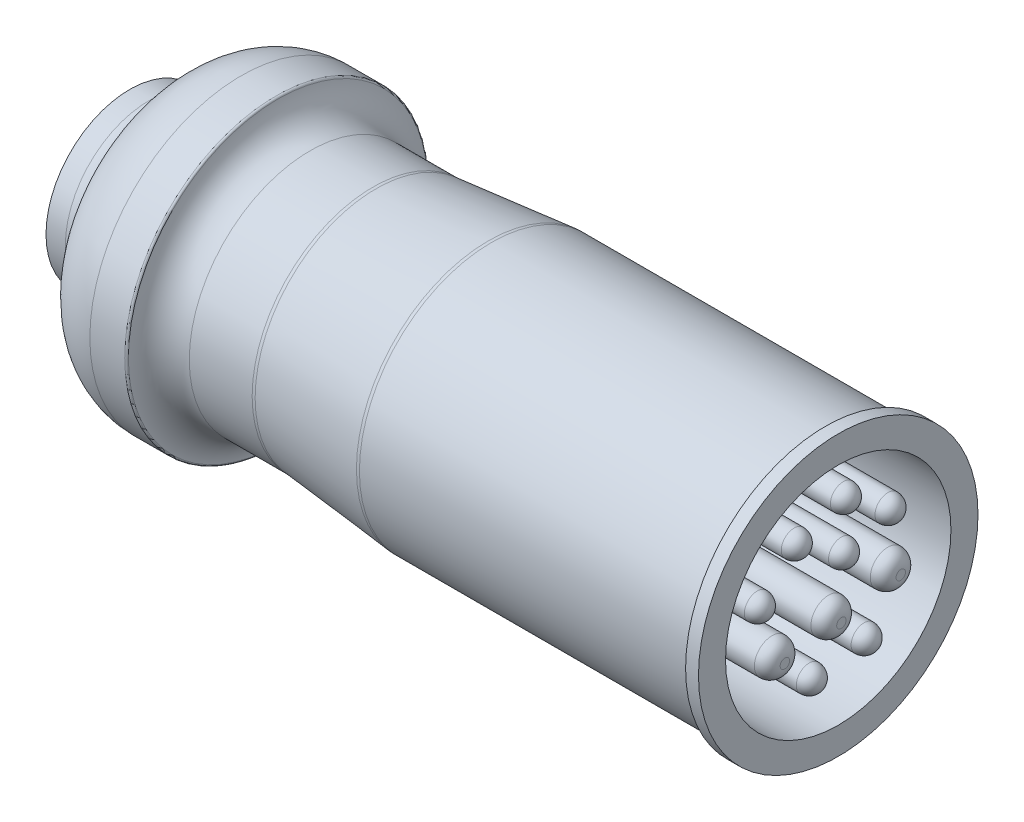
ISO-10303-21;
HEADER;
FILE_DESCRIPTION(('STEP AP214'),'2;1');
FILE_NAME('part.step','',(''),(''),'','','');
FILE_SCHEMA(('AUTOMOTIVE_DESIGN { 1 0 10303 214 1 1 1 1 }'));
ENDSEC;
DATA;
#1=APPLICATION_CONTEXT('core data for automotive mechanical design processes');
#2=APPLICATION_PROTOCOL_DEFINITION('international standard','automotive_design',2000,#1);
#3=PRODUCT_CONTEXT('',#1,'mechanical');
#4=PRODUCT('Part','Part','',(#3));
#5=PRODUCT_RELATED_PRODUCT_CATEGORY('part','',(#4));
#6=PRODUCT_DEFINITION_FORMATION('','',#4);
#7=PRODUCT_DEFINITION_CONTEXT('part definition',#1,'design');
#8=PRODUCT_DEFINITION('design','',#6,#7);
#9=PRODUCT_DEFINITION_SHAPE('','',#8);
#10=(LENGTH_UNIT() NAMED_UNIT(*) SI_UNIT(.MILLI.,.METRE.));
#11=(NAMED_UNIT(*) PLANE_ANGLE_UNIT() SI_UNIT($,.RADIAN.));
#12=(NAMED_UNIT(*) SI_UNIT($,.STERADIAN.) SOLID_ANGLE_UNIT());
#13=UNCERTAINTY_MEASURE_WITH_UNIT(LENGTH_MEASURE(1.E-05),#10,'distance_accuracy_value','');
#14=(GEOMETRIC_REPRESENTATION_CONTEXT(3) GLOBAL_UNCERTAINTY_ASSIGNED_CONTEXT((#13)) GLOBAL_UNIT_ASSIGNED_CONTEXT((#10,
#11,#12)) REPRESENTATION_CONTEXT('',''));
#15=CARTESIAN_POINT('',(0.,0.,0.));
#16=DIRECTION('',(0.,0.,1.));
#17=DIRECTION('',(1.,0.,0.));
#18=AXIS2_PLACEMENT_3D('',#15,#16,#17);
#19=CARTESIAN_POINT('',(0.,0.,0.));
#20=DIRECTION('',(-1.,0.,0.));
#21=DIRECTION('',(0.,0.,1.));
#22=AXIS2_PLACEMENT_3D('',#19,#20,#21);
#23=CYLINDRICAL_SURFACE('',#22,20.5);
#24=CARTESIAN_POINT('',(11.1583612134992,0.,0.));
#25=DIRECTION('',(1.,0.,0.));
#26=DIRECTION('',(0.,0.,-1.));
#27=AXIS2_PLACEMENT_3D('',#24,#25,#26);
#28=CIRCLE('',#27,20.5);
#29=CARTESIAN_POINT('',(11.1583612134992,0.,-20.5));
#30=VERTEX_POINT('',#29);
#31=EDGE_CURVE('E107',#30,#30,#28,.T.);
#32=ORIENTED_EDGE('',*,*,#31,.T.);
#33=EDGE_LOOP('',(#32));
#34=FACE_BOUND('',#33,.T.);
#35=CARTESIAN_POINT('',(63.,0.,0.));
#36=DIRECTION('',(1.,0.,0.));
#37=DIRECTION('',(0.,0.,-1.));
#38=AXIS2_PLACEMENT_3D('',#35,#36,#37);
#39=CIRCLE('',#38,20.5);
#40=CARTESIAN_POINT('',(63.,0.,-20.5));
#41=VERTEX_POINT('',#40);
#42=EDGE_CURVE('E10',#41,#41,#39,.T.);
#43=ORIENTED_EDGE('',*,*,#42,.F.);
#44=EDGE_LOOP('',(#43));
#45=FACE_BOUND('',#44,.T.);
#46=ADVANCED_FACE('F33',(#34,#45),#23,.T.);
#47=CARTESIAN_POINT('',(-45.,13.,0.));
#48=DIRECTION('',(1.,0.,0.));
#49=DIRECTION('',(0.,0.,-1.));
#50=AXIS2_PLACEMENT_3D('',#47,#48,#49);
#51=PLANE('',#50);
#52=CARTESIAN_POINT('',(-45.,0.,0.));
#53=DIRECTION('',(-1.,0.,0.));
#54=DIRECTION('',(0.,0.,1.));
#55=AXIS2_PLACEMENT_3D('',#52,#53,#54);
#56=CIRCLE('',#55,13.);
#57=CARTESIAN_POINT('',(-45.,0.,13.));
#58=VERTEX_POINT('',#57);
#59=EDGE_CURVE('E125',#58,#58,#56,.T.);
#60=ORIENTED_EDGE('',*,*,#59,.T.);
#61=EDGE_LOOP('',(#60));
#62=FACE_BOUND('',#61,.T.);
#63=ADVANCED_FACE('F197',(#62),#51,.F.);
#64=CARTESIAN_POINT('',(0.,0.,0.));
#65=DIRECTION('',(-1.,0.,0.));
#66=DIRECTION('',(0.,0.,1.));
#67=AXIS2_PLACEMENT_3D('',#64,#65,#66);
#68=CYLINDRICAL_SURFACE('',#67,13.);
#69=ORIENTED_EDGE('',*,*,#59,.F.);
#70=EDGE_LOOP('',(#69));
#71=FACE_BOUND('',#70,.T.);
#72=CARTESIAN_POINT('',(-42.,0.,0.));
#73=DIRECTION('',(-1.,0.,0.));
#74=DIRECTION('',(0.,0.,1.));
#75=AXIS2_PLACEMENT_3D('',#72,#73,#74);
#76=CIRCLE('',#75,13.);
#77=CARTESIAN_POINT('',(-42.,0.,13.));
#78=VERTEX_POINT('',#77);
#79=EDGE_CURVE('E128',#78,#78,#76,.T.);
#80=ORIENTED_EDGE('',*,*,#79,.T.);
#81=EDGE_LOOP('',(#80));
#82=FACE_BOUND('',#81,.T.);
#83=ADVANCED_FACE('F203',(#71,#82),#68,.T.);
#84=CARTESIAN_POINT('',(-42.,0.,0.));
#85=DIRECTION('',(-1.,0.,0.));
#86=DIRECTION('',(0.,0.,1.));
#87=AXIS2_PLACEMENT_3D('',#84,#85,#86);
#88=TOROIDAL_SURFACE('',#87,17.,4.);
#89=ORIENTED_EDGE('',*,*,#79,.F.);
#90=EDGE_LOOP('',(#89));
#91=FACE_BOUND('',#90,.T.);
#92=CARTESIAN_POINT('',(-38.1842431943322,0.,0.));
#93=DIRECTION('',(-1.,0.,0.));
#94=DIRECTION('',(0.,0.,1.));
#95=AXIS2_PLACEMENT_3D('',#92,#93,#94);
#96=CIRCLE('',#95,15.8);
#97=CARTESIAN_POINT('',(-38.1842431943322,0.,15.8));
#98=VERTEX_POINT('',#97);
#99=EDGE_CURVE('E131',#98,#98,#96,.T.);
#100=ORIENTED_EDGE('',*,*,#99,.T.);
#101=EDGE_LOOP('',(#100));
#102=FACE_BOUND('',#101,.T.);
#103=ADVANCED_FACE('F227',(#91,#102),#88,.F.);
#104=CARTESIAN_POINT('',(-27.6909119787458,0.,0.));
#105=DIRECTION('',(-1.,0.,0.));
#106=DIRECTION('',(0.,0.,1.));
#107=AXIS2_PLACEMENT_3D('',#104,#105,#106);
#108=TOROIDAL_SURFACE('',#107,12.5,11.);
#109=ORIENTED_EDGE('',*,*,#99,.F.);
#110=EDGE_LOOP('',(#109));
#111=FACE_BOUND('',#110,.T.);
#112=CARTESIAN_POINT('',(-27.6909119787458,0.,0.));
#113=DIRECTION('',(-1.,0.,0.));
#114=DIRECTION('',(0.,0.,1.));
#115=AXIS2_PLACEMENT_3D('',#112,#113,#114);
#116=CIRCLE('',#115,23.5);
#117=CARTESIAN_POINT('',(-27.6909119787458,0.,23.5));
#118=VERTEX_POINT('',#117);
#119=EDGE_CURVE('E134',#118,#118,#116,.T.);
#120=ORIENTED_EDGE('',*,*,#119,.T.);
#121=EDGE_LOOP('',(#120));
#122=FACE_BOUND('',#121,.T.);
#123=ADVANCED_FACE('F223',(#111,#122),#108,.T.);
#124=CARTESIAN_POINT('',(0.,0.,0.));
#125=DIRECTION('',(-1.,0.,0.));
#126=DIRECTION('',(0.,0.,1.));
#127=AXIS2_PLACEMENT_3D('',#124,#125,#126);
#128=CYLINDRICAL_SURFACE('',#127,23.5);
#129=CARTESIAN_POINT('',(-22.2776389283821,0.,0.));
#130=DIRECTION('',(1.,0.,0.));
#131=DIRECTION('',(0.,0.,-1.));
#132=AXIS2_PLACEMENT_3D('',#129,#130,#131);
#133=CIRCLE('',#132,23.5);
#134=CARTESIAN_POINT('',(-22.2776389283821,0.,-23.5));
#135=VERTEX_POINT('',#134);
#136=EDGE_CURVE('E119',#135,#135,#133,.F.);
#137=ORIENTED_EDGE('',*,*,#136,.T.);
#138=EDGE_LOOP('',(#137));
#139=FACE_BOUND('',#138,.T.);
#140=ORIENTED_EDGE('',*,*,#119,.F.);
#141=EDGE_LOOP('',(#140));
#142=FACE_BOUND('',#141,.T.);
#143=ADVANCED_FACE('F219',(#139,#142),#128,.T.);
#144=CARTESIAN_POINT('',(0.,0.,0.));
#145=DIRECTION('',(-1.,0.,0.));
#146=DIRECTION('',(0.,0.,1.));
#147=AXIS2_PLACEMENT_3D('',#144,#145,#146);
#148=CYLINDRICAL_SURFACE('',#147,18.75);
#149=CARTESIAN_POINT('',(-7.24363263615247,0.,0.));
#150=DIRECTION('',(-1.,0.,0.));
#151=DIRECTION('',(0.,0.,1.));
#152=AXIS2_PLACEMENT_3D('',#149,#150,#151);
#153=CIRCLE('',#152,18.75);
#154=CARTESIAN_POINT('',(-7.24363263615247,0.,18.75));
#155=VERTEX_POINT('',#154);
#156=EDGE_CURVE('E104',#155,#155,#153,.T.);
#157=ORIENTED_EDGE('',*,*,#156,.T.);
#158=EDGE_LOOP('',(#157));
#159=FACE_BOUND('',#158,.T.);
#160=CARTESIAN_POINT('',(-17.0062539111405,0.,0.));
#161=DIRECTION('',(-1.,0.,0.));
#162=DIRECTION('',(0.,0.,1.));
#163=AXIS2_PLACEMENT_3D('',#160,#161,#162);
#164=CIRCLE('',#163,18.75);
#165=CARTESIAN_POINT('',(-17.0062539111405,0.,18.75));
#166=VERTEX_POINT('',#165);
#167=EDGE_CURVE('E122',#166,#166,#164,.F.);
#168=ORIENTED_EDGE('',*,*,#167,.T.);
#169=EDGE_LOOP('',(#168));
#170=FACE_BOUND('',#169,.T.);
#171=ADVANCED_FACE('F215',(#159,#170),#148,.T.);
#172=CARTESIAN_POINT('',(10.9147285773466,0.,0.));
#173=DIRECTION('',(1.,0.,0.));
#174=DIRECTION('',(0.,0.,-1.));
#175=AXIS2_PLACEMENT_3D('',#172,#173,#174);
#176=CONICAL_SURFACE('',#175,20.5,0.0973760373811173);
#177=CARTESIAN_POINT('',(10.6722501023881,0.,0.));
#178=DIRECTION('',(-1.,0.,0.));
#179=DIRECTION('',(0.,0.,1.));
#180=AXIS2_PLACEMENT_3D('',#177,#178,#179);
#181=CIRCLE('',#180,20.4763134937074);
#182=CARTESIAN_POINT('',(10.6722501023881,0.,20.4763134937074));
#183=VERTEX_POINT('',#182);
#184=EDGE_CURVE('E110',#183,#183,#181,.T.);
#185=ORIENTED_EDGE('',*,*,#184,.T.);
#186=EDGE_LOOP('',(#185));
#187=FACE_BOUND('',#186,.T.);
#188=CARTESIAN_POINT('',(-6.75752152504136,0.,0.));
#189=DIRECTION('',(1.,0.,0.));
#190=DIRECTION('',(0.,0.,-1.));
#191=AXIS2_PLACEMENT_3D('',#188,#189,#190);
#192=CIRCLE('',#191,18.7736865062926);
#193=CARTESIAN_POINT('',(-6.75752152504136,0.,-18.7736865062926));
#194=VERTEX_POINT('',#193);
#195=EDGE_CURVE('E113',#194,#194,#192,.T.);
#196=ORIENTED_EDGE('',*,*,#195,.T.);
#197=EDGE_LOOP('',(#196));
#198=FACE_BOUND('',#197,.T.);
#199=ADVANCED_FACE('F211',(#187,#198),#176,.T.);
#200=CARTESIAN_POINT('',(-17.0062539111405,0.,0.));
#201=DIRECTION('',(-1.,0.,0.));
#202=DIRECTION('',(0.,0.,1.));
#203=AXIS2_PLACEMENT_3D('',#200,#201,#202);
#204=TOROIDAL_SURFACE('',#203,23.75,5.);
#205=CARTESIAN_POINT('',(-21.9792586443877,0.,0.));
#206=DIRECTION('',(1.,0.,0.));
#207=DIRECTION('',(0.,0.,-1.));
#208=AXIS2_PLACEMENT_3D('',#205,#206,#207);
#209=CIRCLE('',#208,23.2311320754717);
#210=CARTESIAN_POINT('',(-21.9792586443877,0.,-23.2311320754717));
#211=VERTEX_POINT('',#210);
#212=EDGE_CURVE('E116',#211,#211,#209,.T.);
#213=ORIENTED_EDGE('',*,*,#212,.T.);
#214=EDGE_LOOP('',(#213));
#215=FACE_BOUND('',#214,.T.);
#216=ORIENTED_EDGE('',*,*,#167,.F.);
#217=EDGE_LOOP('',(#216));
#218=FACE_BOUND('',#217,.T.);
#219=ADVANCED_FACE('F214',(#215,#218),#204,.F.);
#220=CARTESIAN_POINT('',(-22.2776389283821,0.,0.));
#221=DIRECTION('',(1.,0.,0.));
#222=DIRECTION('',(0.,0.,-1.));
#223=AXIS2_PLACEMENT_3D('',#220,#221,#222);
#224=TOROIDAL_SURFACE('',#223,23.2,0.3);
#225=ORIENTED_EDGE('',*,*,#212,.F.);
#226=EDGE_LOOP('',(#225));
#227=FACE_BOUND('',#226,.T.);
#228=ORIENTED_EDGE('',*,*,#136,.F.);
#229=EDGE_LOOP('',(#228));
#230=FACE_BOUND('',#229,.T.);
#231=ADVANCED_FACE('F241',(#227,#230),#224,.T.);
#232=CARTESIAN_POINT('',(11.1583612134992,0.,0.));
#233=DIRECTION('',(1.,0.,0.));
#234=DIRECTION('',(0.,0.,-1.));
#235=AXIS2_PLACEMENT_3D('',#232,#233,#234);
#236=TOROIDAL_SURFACE('',#235,15.5,5.);
#237=ORIENTED_EDGE('',*,*,#31,.F.);
#238=EDGE_LOOP('',(#237));
#239=FACE_BOUND('',#238,.T.);
#240=ORIENTED_EDGE('',*,*,#184,.F.);
#241=EDGE_LOOP('',(#240));
#242=FACE_BOUND('',#241,.T.);
#243=ADVANCED_FACE('F245',(#239,#242),#236,.T.);
#244=CARTESIAN_POINT('',(-7.24363263615247,0.,0.));
#245=DIRECTION('',(-1.,0.,0.));
#246=DIRECTION('',(0.,0.,1.));
#247=AXIS2_PLACEMENT_3D('',#244,#245,#246);
#248=TOROIDAL_SURFACE('',#247,23.75,5.);
#249=ORIENTED_EDGE('',*,*,#195,.F.);
#250=EDGE_LOOP('',(#249));
#251=FACE_BOUND('',#250,.T.);
#252=ORIENTED_EDGE('',*,*,#156,.F.);
#253=EDGE_LOOP('',(#252));
#254=FACE_BOUND('',#253,.T.);
#255=ADVANCED_FACE('F194',(#251,#254),#248,.F.);
#256=CARTESIAN_POINT('',(63.,0.,0.));
#257=DIRECTION('',(1.,0.,0.));
#258=DIRECTION('',(0.,0.,-1.));
#259=AXIS2_PLACEMENT_3D('',#256,#257,#258);
#260=CYLINDRICAL_SURFACE('',#259,21.7);
#261=CARTESIAN_POINT('',(63.,0.,0.));
#262=DIRECTION('',(1.,0.,0.));
#263=DIRECTION('',(0.,0.,-1.));
#264=AXIS2_PLACEMENT_3D('',#261,#262,#263);
#265=CIRCLE('',#264,21.7);
#266=CARTESIAN_POINT('',(63.,0.,-21.7));
#267=VERTEX_POINT('',#266);
#268=EDGE_CURVE('E173',#267,#267,#265,.T.);
#269=ORIENTED_EDGE('',*,*,#268,.T.);
#270=EDGE_LOOP('',(#269));
#271=FACE_BOUND('',#270,.T.);
#272=CARTESIAN_POINT('',(65.,0.,0.));
#273=DIRECTION('',(1.,0.,0.));
#274=DIRECTION('',(0.,0.,-1.));
#275=AXIS2_PLACEMENT_3D('',#272,#273,#274);
#276=CIRCLE('',#275,21.7);
#277=CARTESIAN_POINT('',(65.,0.,-21.7));
#278=VERTEX_POINT('',#277);
#279=EDGE_CURVE('E174',#278,#278,#276,.T.);
#280=ORIENTED_EDGE('',*,*,#279,.F.);
#281=EDGE_LOOP('',(#280));
#282=FACE_BOUND('',#281,.T.);
#283=ADVANCED_FACE('F180',(#271,#282),#260,.T.);
#284=CARTESIAN_POINT('',(63.,0.,0.));
#285=DIRECTION('',(1.,0.,0.));
#286=DIRECTION('',(0.,0.,-1.));
#287=AXIS2_PLACEMENT_3D('',#284,#285,#286);
#288=PLANE('',#287);
#289=ORIENTED_EDGE('',*,*,#42,.T.);
#290=EDGE_LOOP('',(#289));
#291=FACE_BOUND('',#290,.T.);
#292=ORIENTED_EDGE('',*,*,#268,.F.);
#293=EDGE_LOOP('',(#292));
#294=FACE_BOUND('',#293,.T.);
#295=ADVANCED_FACE('F183',(#291,#294),#288,.F.);
#296=CARTESIAN_POINT('',(65.,0.,0.));
#297=DIRECTION('',(-1.,0.,0.));
#298=DIRECTION('',(0.,0.,1.));
#299=AXIS2_PLACEMENT_3D('',#296,#297,#298);
#300=PLANE('',#299);
#301=CARTESIAN_POINT('',(65.,3.56731656131285,-2.48519986218187));
#302=DIRECTION('',(-1.,0.,0.));
#303=DIRECTION('',(0.,0.,1.));
#304=AXIS2_PLACEMENT_3D('',#301,#302,#303);
#305=CIRCLE('',#304,0.000606669885716993);
#306=CARTESIAN_POINT('',(65.,3.56731656131285,-2.48459319229615));
#307=VERTEX_POINT('',#306);
#308=EDGE_CURVE('E62',#307,#307,#305,.F.);
#309=ORIENTED_EDGE('',*,*,#308,.T.);
#310=EDGE_LOOP('',(#309));
#311=FACE_BOUND('',#310,.T.);
#312=ADVANCED_FACE('F185',(#311),#300,.F.);
#313=CARTESIAN_POINT('',(65.,0.,0.));
#314=DIRECTION('',(-1.,0.,0.));
#315=DIRECTION('',(0.,0.,1.));
#316=AXIS2_PLACEMENT_3D('',#313,#314,#315);
#317=PLANE('',#316);
#318=CARTESIAN_POINT('',(65.,10.8693952367516,-2.78447552930021));
#319=DIRECTION('',(-1.,0.,0.));
#320=DIRECTION('',(0.,0.,1.));
#321=AXIS2_PLACEMENT_3D('',#318,#319,#320);
#322=CIRCLE('',#321,0.000606669885715692);
#323=CARTESIAN_POINT('',(65.,10.8693952367516,-2.78386885941449));
#324=VERTEX_POINT('',#323);
#325=EDGE_CURVE('E48',#324,#324,#322,.F.);
#326=ORIENTED_EDGE('',*,*,#325,.T.);
#327=EDGE_LOOP('',(#326));
#328=FACE_BOUND('',#327,.T.);
#329=ADVANCED_FACE('F191',(#328),#317,.F.);
#330=CARTESIAN_POINT('',(65.,0.,0.));
#331=DIRECTION('',(-1.,0.,0.));
#332=DIRECTION('',(0.,0.,1.));
#333=AXIS2_PLACEMENT_3D('',#330,#331,#332);
#334=PLANE('',#333);
#335=CARTESIAN_POINT('',(65.,8.44417520421064,4.84394384578304));
#336=DIRECTION('',(-1.,0.,0.));
#337=DIRECTION('',(0.,0.,1.));
#338=AXIS2_PLACEMENT_3D('',#335,#336,#337);
#339=CIRCLE('',#338,0.000606669885717427);
#340=CARTESIAN_POINT('',(65.,8.44417520421064,4.84455051566875));
#341=VERTEX_POINT('',#340);
#342=EDGE_CURVE('E40',#341,#341,#339,.F.);
#343=ORIENTED_EDGE('',*,*,#342,.T.);
#344=EDGE_LOOP('',(#343));
#345=FACE_BOUND('',#344,.T.);
#346=ADVANCED_FACE('F531',(#345),#334,.F.);
#347=CARTESIAN_POINT('',(65.,0.,0.));
#348=DIRECTION('',(-1.,0.,0.));
#349=DIRECTION('',(0.,0.,1.));
#350=AXIS2_PLACEMENT_3D('',#347,#348,#349);
#351=PLANE('',#350);
#352=CARTESIAN_POINT('',(65.,2.84412167452525,10.5762821045161));
#353=DIRECTION('',(-1.,0.,0.));
#354=DIRECTION('',(0.,0.,1.));
#355=AXIS2_PLACEMENT_3D('',#352,#353,#354);
#356=CIRCLE('',#355,0.00060666988571656);
#357=CARTESIAN_POINT('',(65.,2.84412167452525,10.5768887744018));
#358=VERTEX_POINT('',#357);
#359=EDGE_CURVE('E68',#358,#358,#356,.F.);
#360=ORIENTED_EDGE('',*,*,#359,.T.);
#361=EDGE_LOOP('',(#360));
#362=FACE_BOUND('',#361,.T.);
#363=ADVANCED_FACE('F511',(#362),#351,.F.);
#364=CARTESIAN_POINT('',(65.,0.,0.));
#365=DIRECTION('',(-1.,0.,0.));
#366=DIRECTION('',(0.,0.,1.));
#367=AXIS2_PLACEMENT_3D('',#364,#365,#366);
#368=PLANE('',#367);
#369=CARTESIAN_POINT('',(65.,5.9307653523046,-9.70737634946245));
#370=DIRECTION('',(-1.,0.,0.));
#371=DIRECTION('',(0.,0.,1.));
#372=AXIS2_PLACEMENT_3D('',#369,#370,#371);
#373=CIRCLE('',#372,0.00060666988571656);
#374=CARTESIAN_POINT('',(65.,5.9307653523046,-9.70676967957674));
#375=VERTEX_POINT('',#374);
#376=EDGE_CURVE('E56',#375,#375,#373,.F.);
#377=ORIENTED_EDGE('',*,*,#376,.T.);
#378=EDGE_LOOP('',(#377));
#379=FACE_BOUND('',#378,.T.);
#380=ADVANCED_FACE('F491',(#379),#368,.F.);
#381=CARTESIAN_POINT('',(65.,0.,0.));
#382=DIRECTION('',(-1.,0.,0.));
#383=DIRECTION('',(0.,0.,1.));
#384=AXIS2_PLACEMENT_3D('',#381,#382,#383);
#385=PLANE('',#384);
#386=CARTESIAN_POINT('',(65.,-10.8693952367516,2.50691363260725));
#387=DIRECTION('',(-1.,0.,0.));
#388=DIRECTION('',(0.,0.,1.));
#389=AXIS2_PLACEMENT_3D('',#386,#387,#388);
#390=CIRCLE('',#389,0.000606669885717427);
#391=CARTESIAN_POINT('',(65.,-10.8693952367516,2.50752030249297));
#392=VERTEX_POINT('',#391);
#393=EDGE_CURVE('E98',#392,#392,#390,.F.);
#394=ORIENTED_EDGE('',*,*,#393,.T.);
#395=EDGE_LOOP('',(#394));
#396=FACE_BOUND('',#395,.T.);
#397=ADVANCED_FACE('F471',(#396),#385,.F.);
#398=CARTESIAN_POINT('',(65.,0.,0.));
#399=DIRECTION('',(-1.,0.,0.));
#400=DIRECTION('',(0.,0.,1.));
#401=AXIS2_PLACEMENT_3D('',#398,#399,#400);
#402=PLANE('',#401);
#403=CARTESIAN_POINT('',(65.,-9.72292758500494,-6.00340393612724));
#404=DIRECTION('',(-1.,0.,0.));
#405=DIRECTION('',(0.,0.,1.));
#406=AXIS2_PLACEMENT_3D('',#403,#404,#405);
#407=CIRCLE('',#406,0.000606669885717427);
#408=CARTESIAN_POINT('',(65.,-9.72292758500494,-6.00279726624152));
#409=VERTEX_POINT('',#408);
#410=EDGE_CURVE('E92',#409,#409,#407,.F.);
#411=ORIENTED_EDGE('',*,*,#410,.T.);
#412=EDGE_LOOP('',(#411));
#413=FACE_BOUND('',#412,.T.);
#414=ADVANCED_FACE('F451',(#413),#402,.F.);
#415=CARTESIAN_POINT('',(65.,0.,0.));
#416=DIRECTION('',(-1.,0.,0.));
#417=DIRECTION('',(0.,0.,1.));
#418=AXIS2_PLACEMENT_3D('',#415,#416,#417);
#419=PLANE('',#418);
#420=CARTESIAN_POINT('',(65.,-2.13860311960426,-9.70737634946245));
#421=DIRECTION('',(-1.,0.,0.));
#422=DIRECTION('',(0.,0.,1.));
#423=AXIS2_PLACEMENT_3D('',#420,#421,#422);
#424=CIRCLE('',#423,0.733173099565215);
#425=CARTESIAN_POINT('',(65.,-2.13860311960426,-8.97420324989724));
#426=VERTEX_POINT('',#425);
#427=EDGE_CURVE('E86',#426,#426,#424,.F.);
#428=ORIENTED_EDGE('',*,*,#427,.T.);
#429=EDGE_LOOP('',(#428));
#430=FACE_BOUND('',#429,.T.);
#431=ADVANCED_FACE('F431',(#430),#419,.F.);
#432=CARTESIAN_POINT('',(65.,0.,0.));
#433=DIRECTION('',(-1.,0.,0.));
#434=DIRECTION('',(0.,0.,1.));
#435=AXIS2_PLACEMENT_3D('',#432,#433,#434);
#436=PLANE('',#435);
#437=CARTESIAN_POINT('',(65.,-3.99058932627187,-0.491540225806979));
#438=DIRECTION('',(-1.,0.,0.));
#439=DIRECTION('',(0.,0.,1.));
#440=AXIS2_PLACEMENT_3D('',#437,#438,#439);
#441=CIRCLE('',#440,0.733173099565215);
#442=CARTESIAN_POINT('',(65.,-3.99058932627187,0.241632873758237));
#443=VERTEX_POINT('',#442);
#444=EDGE_CURVE('E80',#443,#443,#441,.F.);
#445=ORIENTED_EDGE('',*,*,#444,.T.);
#446=EDGE_LOOP('',(#445));
#447=FACE_BOUND('',#446,.T.);
#448=ADVANCED_FACE('F411',(#447),#436,.F.);
#449=CARTESIAN_POINT('',(65.,0.,0.));
#450=DIRECTION('',(-1.,0.,0.));
#451=DIRECTION('',(0.,0.,1.));
#452=AXIS2_PLACEMENT_3D('',#449,#450,#451);
#453=PLANE('',#452);
#454=CARTESIAN_POINT('',(65.,-5.04886715865336,8.28334680102288));
#455=DIRECTION('',(-1.,0.,0.));
#456=DIRECTION('',(0.,0.,1.));
#457=AXIS2_PLACEMENT_3D('',#454,#455,#456);
#458=CIRCLE('',#457,0.733173099565215);
#459=CARTESIAN_POINT('',(65.,-5.04886715865336,9.0165199005881));
#460=VERTEX_POINT('',#459);
#461=EDGE_CURVE('E74',#460,#460,#458,.F.);
#462=ORIENTED_EDGE('',*,*,#461,.T.);
#463=EDGE_LOOP('',(#462));
#464=FACE_BOUND('',#463,.T.);
#465=ADVANCED_FACE('F283',(#464),#453,.F.);
#466=CARTESIAN_POINT('',(63.,3.56731656131285,-2.48519986218187));
#467=DIRECTION('',(-1.,0.,0.));
#468=DIRECTION('',(0.,0.,1.));
#469=AXIS2_PLACEMENT_3D('',#466,#467,#468);
#470=DEGENERATE_TOROIDAL_SURFACE('',#469,0.000606669885716993,2.,.T.);
#471=ORIENTED_EDGE('',*,*,#308,.F.);
#472=EDGE_LOOP('',(#471));
#473=FACE_BOUND('',#472,.T.);
#474=CARTESIAN_POINT('',(63.,3.56731656131285,-2.48519986218187));
#475=DIRECTION('',(-1.,0.,0.));
#476=DIRECTION('',(0.,0.,1.));
#477=AXIS2_PLACEMENT_3D('',#474,#475,#476);
#478=CIRCLE('',#477,2.00060666988572);
#479=CARTESIAN_POINT('',(63.,3.56731656131285,-0.484593192296154));
#480=VERTEX_POINT('',#479);
#481=EDGE_CURVE('E65',#480,#480,#478,.T.);
#482=ORIENTED_EDGE('',*,*,#481,.F.);
#483=EDGE_LOOP('',(#482));
#484=FACE_BOUND('',#483,.T.);
#485=ADVANCED_FACE('F279',(#473,#484),#470,.T.);
#486=CARTESIAN_POINT('',(63.,10.8693952367516,-2.78447552930021));
#487=DIRECTION('',(-1.,0.,0.));
#488=DIRECTION('',(0.,0.,1.));
#489=AXIS2_PLACEMENT_3D('',#486,#487,#488);
#490=DEGENERATE_TOROIDAL_SURFACE('',#489,0.000606669885715692,2.,.T.);
#491=ORIENTED_EDGE('',*,*,#325,.F.);
#492=EDGE_LOOP('',(#491));
#493=FACE_BOUND('',#492,.T.);
#494=CARTESIAN_POINT('',(63.,10.8693952367516,-2.78447552930021));
#495=DIRECTION('',(-1.,0.,0.));
#496=DIRECTION('',(0.,0.,1.));
#497=AXIS2_PLACEMENT_3D('',#494,#495,#496);
#498=CIRCLE('',#497,2.00060666988572);
#499=CARTESIAN_POINT('',(63.,10.8693952367516,-0.783868859414489));
#500=VERTEX_POINT('',#499);
#501=EDGE_CURVE('E53',#500,#500,#498,.T.);
#502=ORIENTED_EDGE('',*,*,#501,.F.);
#503=EDGE_LOOP('',(#502));
#504=FACE_BOUND('',#503,.T.);
#505=ADVANCED_FACE('F282',(#493,#504),#490,.T.);
#506=CARTESIAN_POINT('',(63.,8.44417520421064,4.84394384578304));
#507=DIRECTION('',(-1.,0.,0.));
#508=DIRECTION('',(0.,0.,1.));
#509=AXIS2_PLACEMENT_3D('',#506,#507,#508);
#510=DEGENERATE_TOROIDAL_SURFACE('',#509,0.000606669885717427,2.,.T.);
#511=ORIENTED_EDGE('',*,*,#342,.F.);
#512=EDGE_LOOP('',(#511));
#513=FACE_BOUND('',#512,.T.);
#514=CARTESIAN_POINT('',(63.,8.44417520421064,4.84394384578304));
#515=DIRECTION('',(-1.,0.,0.));
#516=DIRECTION('',(0.,0.,1.));
#517=AXIS2_PLACEMENT_3D('',#514,#515,#516);
#518=CIRCLE('',#517,2.00060666988572);
#519=CARTESIAN_POINT('',(63.,8.44417520421064,6.84455051566875));
#520=VERTEX_POINT('',#519);
#521=EDGE_CURVE('E44',#520,#520,#518,.T.);
#522=ORIENTED_EDGE('',*,*,#521,.F.);
#523=EDGE_LOOP('',(#522));
#524=FACE_BOUND('',#523,.T.);
#525=ADVANCED_FACE('F35',(#513,#524),#510,.T.);
#526=CARTESIAN_POINT('',(63.,2.84412167452525,10.5762821045161));
#527=DIRECTION('',(-1.,0.,0.));
#528=DIRECTION('',(0.,0.,1.));
#529=AXIS2_PLACEMENT_3D('',#526,#527,#528);
#530=DEGENERATE_TOROIDAL_SURFACE('',#529,0.00060666988571656,2.,.T.);
#531=ORIENTED_EDGE('',*,*,#359,.F.);
#532=EDGE_LOOP('',(#531));
#533=FACE_BOUND('',#532,.T.);
#534=CARTESIAN_POINT('',(63.,2.84412167452525,10.5762821045161));
#535=DIRECTION('',(-1.,0.,0.));
#536=DIRECTION('',(0.,0.,1.));
#537=AXIS2_PLACEMENT_3D('',#534,#535,#536);
#538=CIRCLE('',#537,2.00060666988572);
#539=CARTESIAN_POINT('',(63.,2.84412167452525,12.5768887744018));
#540=VERTEX_POINT('',#539);
#541=EDGE_CURVE('E71',#540,#540,#538,.T.);
#542=ORIENTED_EDGE('',*,*,#541,.F.);
#543=EDGE_LOOP('',(#542));
#544=FACE_BOUND('',#543,.T.);
#545=ADVANCED_FACE('F275',(#533,#544),#530,.T.);
#546=CARTESIAN_POINT('',(63.,5.9307653523046,-9.70737634946245));
#547=DIRECTION('',(-1.,0.,0.));
#548=DIRECTION('',(0.,0.,1.));
#549=AXIS2_PLACEMENT_3D('',#546,#547,#548);
#550=DEGENERATE_TOROIDAL_SURFACE('',#549,0.00060666988571656,2.,.T.);
#551=ORIENTED_EDGE('',*,*,#376,.F.);
#552=EDGE_LOOP('',(#551));
#553=FACE_BOUND('',#552,.T.);
#554=CARTESIAN_POINT('',(63.,5.9307653523046,-9.70737634946245));
#555=DIRECTION('',(-1.,0.,0.));
#556=DIRECTION('',(0.,0.,1.));
#557=AXIS2_PLACEMENT_3D('',#554,#555,#556);
#558=CIRCLE('',#557,2.00060666988572);
#559=CARTESIAN_POINT('',(63.,5.9307653523046,-7.70676967957674));
#560=VERTEX_POINT('',#559);
#561=EDGE_CURVE('E59',#560,#560,#558,.T.);
#562=ORIENTED_EDGE('',*,*,#561,.F.);
#563=EDGE_LOOP('',(#562));
#564=FACE_BOUND('',#563,.T.);
#565=ADVANCED_FACE('F257',(#553,#564),#550,.T.);
#566=CARTESIAN_POINT('',(63.,-10.8693952367516,2.50691363260725));
#567=DIRECTION('',(-1.,0.,0.));
#568=DIRECTION('',(0.,0.,1.));
#569=AXIS2_PLACEMENT_3D('',#566,#567,#568);
#570=DEGENERATE_TOROIDAL_SURFACE('',#569,0.000606669885717427,2.,.T.);
#571=ORIENTED_EDGE('',*,*,#393,.F.);
#572=EDGE_LOOP('',(#571));
#573=FACE_BOUND('',#572,.T.);
#574=CARTESIAN_POINT('',(63.,-10.8693952367516,2.50691363260725));
#575=DIRECTION('',(-1.,0.,0.));
#576=DIRECTION('',(0.,0.,1.));
#577=AXIS2_PLACEMENT_3D('',#574,#575,#576);
#578=CIRCLE('',#577,2.00060666988572);
#579=CARTESIAN_POINT('',(63.,-10.8693952367516,4.50752030249297));
#580=VERTEX_POINT('',#579);
#581=EDGE_CURVE('E101',#580,#580,#578,.T.);
#582=ORIENTED_EDGE('',*,*,#581,.F.);
#583=EDGE_LOOP('',(#582));
#584=FACE_BOUND('',#583,.T.);
#585=ADVANCED_FACE('F253',(#573,#584),#570,.T.);
#586=CARTESIAN_POINT('',(63.,-9.72292758500494,-6.00340393612724));
#587=DIRECTION('',(-1.,0.,0.));
#588=DIRECTION('',(0.,0.,1.));
#589=AXIS2_PLACEMENT_3D('',#586,#587,#588);
#590=DEGENERATE_TOROIDAL_SURFACE('',#589,0.000606669885717427,2.,.T.);
#591=ORIENTED_EDGE('',*,*,#410,.F.);
#592=EDGE_LOOP('',(#591));
#593=FACE_BOUND('',#592,.T.);
#594=CARTESIAN_POINT('',(63.,-9.72292758500494,-6.00340393612724));
#595=DIRECTION('',(-1.,0.,0.));
#596=DIRECTION('',(0.,0.,1.));
#597=AXIS2_PLACEMENT_3D('',#594,#595,#596);
#598=CIRCLE('',#597,2.00060666988572);
#599=CARTESIAN_POINT('',(63.,-9.72292758500494,-4.00279726624152));
#600=VERTEX_POINT('',#599);
#601=EDGE_CURVE('E95',#600,#600,#598,.T.);
#602=ORIENTED_EDGE('',*,*,#601,.F.);
#603=EDGE_LOOP('',(#602));
#604=FACE_BOUND('',#603,.T.);
#605=ADVANCED_FACE('F256',(#593,#604),#590,.T.);
#606=CARTESIAN_POINT('',(63.,-2.13860311960426,-9.70737634946245));
#607=DIRECTION('',(-1.,0.,0.));
#608=DIRECTION('',(0.,0.,1.));
#609=AXIS2_PLACEMENT_3D('',#606,#607,#608);
#610=DEGENERATE_TOROIDAL_SURFACE('',#609,0.733173099565215,2.,.T.);
#611=ORIENTED_EDGE('',*,*,#427,.F.);
#612=EDGE_LOOP('',(#611));
#613=FACE_BOUND('',#612,.T.);
#614=CARTESIAN_POINT('',(63.,-2.13860311960426,-9.70737634946245));
#615=DIRECTION('',(-1.,0.,0.));
#616=DIRECTION('',(0.,0.,1.));
#617=AXIS2_PLACEMENT_3D('',#614,#615,#616);
#618=CIRCLE('',#617,2.73317309956522);
#619=CARTESIAN_POINT('',(63.,-2.13860311960426,-6.97420324989724));
#620=VERTEX_POINT('',#619);
#621=EDGE_CURVE('E89',#620,#620,#618,.T.);
#622=ORIENTED_EDGE('',*,*,#621,.F.);
#623=EDGE_LOOP('',(#622));
#624=FACE_BOUND('',#623,.T.);
#625=ADVANCED_FACE('F261',(#613,#624),#610,.T.);
#626=CARTESIAN_POINT('',(63.,-3.99058932627187,-0.491540225806979));
#627=DIRECTION('',(-1.,0.,0.));
#628=DIRECTION('',(0.,0.,1.));
#629=AXIS2_PLACEMENT_3D('',#626,#627,#628);
#630=DEGENERATE_TOROIDAL_SURFACE('',#629,0.733173099565215,2.,.T.);
#631=ORIENTED_EDGE('',*,*,#444,.F.);
#632=EDGE_LOOP('',(#631));
#633=FACE_BOUND('',#632,.T.);
#634=CARTESIAN_POINT('',(63.,-3.99058932627187,-0.491540225806979));
#635=DIRECTION('',(-1.,0.,0.));
#636=DIRECTION('',(0.,0.,1.));
#637=AXIS2_PLACEMENT_3D('',#634,#635,#636);
#638=CIRCLE('',#637,2.73317309956522);
#639=CARTESIAN_POINT('',(63.,-3.99058932627187,2.24163287375824));
#640=VERTEX_POINT('',#639);
#641=EDGE_CURVE('E83',#640,#640,#638,.T.);
#642=ORIENTED_EDGE('',*,*,#641,.F.);
#643=EDGE_LOOP('',(#642));
#644=FACE_BOUND('',#643,.T.);
#645=ADVANCED_FACE('F265',(#633,#644),#630,.T.);
#646=CARTESIAN_POINT('',(63.,-5.04886715865336,8.28334680102288));
#647=DIRECTION('',(-1.,0.,0.));
#648=DIRECTION('',(0.,0.,1.));
#649=AXIS2_PLACEMENT_3D('',#646,#647,#648);
#650=DEGENERATE_TOROIDAL_SURFACE('',#649,0.733173099565215,2.,.T.);
#651=ORIENTED_EDGE('',*,*,#461,.F.);
#652=EDGE_LOOP('',(#651));
#653=FACE_BOUND('',#652,.T.);
#654=CARTESIAN_POINT('',(63.,-5.04886715865336,8.28334680102288));
#655=DIRECTION('',(-1.,0.,0.));
#656=DIRECTION('',(0.,0.,1.));
#657=AXIS2_PLACEMENT_3D('',#654,#655,#656);
#658=CIRCLE('',#657,2.73317309956522);
#659=CARTESIAN_POINT('',(63.,-5.04886715865336,11.0165199005881));
#660=VERTEX_POINT('',#659);
#661=EDGE_CURVE('E77',#660,#660,#658,.T.);
#662=ORIENTED_EDGE('',*,*,#661,.F.);
#663=EDGE_LOOP('',(#662));
#664=FACE_BOUND('',#663,.T.);
#665=ADVANCED_FACE('F269',(#653,#664),#650,.T.);
#666=CARTESIAN_POINT('',(72.7305809314369,3.56731656131285,-2.48519986218187));
#667=DIRECTION('',(-1.,0.,0.));
#668=DIRECTION('',(0.,0.,1.));
#669=AXIS2_PLACEMENT_3D('',#666,#667,#668);
#670=CYLINDRICAL_SURFACE('',#669,2.00060666988572);
#671=ORIENTED_EDGE('',*,*,#481,.T.);
#672=EDGE_LOOP('',(#671));
#673=FACE_BOUND('',#672,.T.);
#674=CARTESIAN_POINT('',(30.,3.56731656131285,-2.48519986218187));
#675=DIRECTION('',(1.,0.,0.));
#676=DIRECTION('',(0.,0.,-1.));
#677=AXIS2_PLACEMENT_3D('',#674,#675,#676);
#678=CIRCLE('',#677,2.00060666988572);
#679=CARTESIAN_POINT('',(30.,3.56731656131285,-4.48580653206759));
#680=VERTEX_POINT('',#679);
#681=EDGE_CURVE('E141',#680,#680,#678,.T.);
#682=ORIENTED_EDGE('',*,*,#681,.T.);
#683=EDGE_LOOP('',(#682));
#684=FACE_BOUND('',#683,.T.);
#685=ADVANCED_FACE('F273',(#673,#684),#670,.T.);
#686=CARTESIAN_POINT('',(72.7305809314369,10.8693952367516,-2.78447552930021));
#687=DIRECTION('',(-1.,0.,0.));
#688=DIRECTION('',(0.,0.,1.));
#689=AXIS2_PLACEMENT_3D('',#686,#687,#688);
#690=CYLINDRICAL_SURFACE('',#689,2.00060666988572);
#691=ORIENTED_EDGE('',*,*,#501,.T.);
#692=EDGE_LOOP('',(#691));
#693=FACE_BOUND('',#692,.T.);
#694=CARTESIAN_POINT('',(30.,10.8693952367516,-2.78447552930021));
#695=DIRECTION('',(1.,0.,0.));
#696=DIRECTION('',(0.,0.,-1.));
#697=AXIS2_PLACEMENT_3D('',#694,#695,#696);
#698=CIRCLE('',#697,2.00060666988572);
#699=CARTESIAN_POINT('',(30.,10.8693952367516,-4.78508219918592));
#700=VERTEX_POINT('',#699);
#701=EDGE_CURVE('E146',#700,#700,#698,.T.);
#702=ORIENTED_EDGE('',*,*,#701,.T.);
#703=EDGE_LOOP('',(#702));
#704=FACE_BOUND('',#703,.T.);
#705=ADVANCED_FACE('F297',(#693,#704),#690,.T.);
#706=CARTESIAN_POINT('',(72.7305809314369,8.44417520421064,4.84394384578304));
#707=DIRECTION('',(-1.,0.,0.));
#708=DIRECTION('',(0.,0.,1.));
#709=AXIS2_PLACEMENT_3D('',#706,#707,#708);
#710=CYLINDRICAL_SURFACE('',#709,2.00060666988572);
#711=ORIENTED_EDGE('',*,*,#521,.T.);
#712=EDGE_LOOP('',(#711));
#713=FACE_BOUND('',#712,.T.);
#714=CARTESIAN_POINT('',(30.,8.44417520421064,4.84394384578304));
#715=DIRECTION('',(1.,0.,0.));
#716=DIRECTION('',(0.,0.,-1.));
#717=AXIS2_PLACEMENT_3D('',#714,#715,#716);
#718=CIRCLE('',#717,2.00060666988572);
#719=CARTESIAN_POINT('',(30.,8.44417520421064,2.84333717589732));
#720=VERTEX_POINT('',#719);
#721=EDGE_CURVE('E149',#720,#720,#718,.T.);
#722=ORIENTED_EDGE('',*,*,#721,.T.);
#723=EDGE_LOOP('',(#722));
#724=FACE_BOUND('',#723,.T.);
#725=ADVANCED_FACE('F300',(#713,#724),#710,.T.);
#726=CARTESIAN_POINT('',(72.7305809314369,2.84412167452525,10.5762821045161));
#727=DIRECTION('',(-1.,0.,0.));
#728=DIRECTION('',(0.,0.,1.));
#729=AXIS2_PLACEMENT_3D('',#726,#727,#728);
#730=CYLINDRICAL_SURFACE('',#729,2.00060666988572);
#731=ORIENTED_EDGE('',*,*,#541,.T.);
#732=EDGE_LOOP('',(#731));
#733=FACE_BOUND('',#732,.T.);
#734=CARTESIAN_POINT('',(30.,2.84412167452525,10.5762821045161));
#735=DIRECTION('',(1.,0.,0.));
#736=DIRECTION('',(0.,0.,-1.));
#737=AXIS2_PLACEMENT_3D('',#734,#735,#736);
#738=CIRCLE('',#737,2.00060666988572);
#739=CARTESIAN_POINT('',(30.,2.84412167452525,8.57567543463039));
#740=VERTEX_POINT('',#739);
#741=EDGE_CURVE('E152',#740,#740,#738,.T.);
#742=ORIENTED_EDGE('',*,*,#741,.T.);
#743=EDGE_LOOP('',(#742));
#744=FACE_BOUND('',#743,.T.);
#745=ADVANCED_FACE('F521',(#733,#744),#730,.T.);
#746=CARTESIAN_POINT('',(72.7305809314369,5.9307653523046,-9.70737634946245));
#747=DIRECTION('',(-1.,0.,0.));
#748=DIRECTION('',(0.,0.,1.));
#749=AXIS2_PLACEMENT_3D('',#746,#747,#748);
#750=CYLINDRICAL_SURFACE('',#749,2.00060666988572);
#751=ORIENTED_EDGE('',*,*,#561,.T.);
#752=EDGE_LOOP('',(#751));
#753=FACE_BOUND('',#752,.T.);
#754=CARTESIAN_POINT('',(30.,5.9307653523046,-9.70737634946245));
#755=DIRECTION('',(1.,0.,0.));
#756=DIRECTION('',(0.,0.,-1.));
#757=AXIS2_PLACEMENT_3D('',#754,#755,#756);
#758=CIRCLE('',#757,2.00060666988572);
#759=CARTESIAN_POINT('',(30.,5.9307653523046,-11.7079830193482));
#760=VERTEX_POINT('',#759);
#761=EDGE_CURVE('E155',#760,#760,#758,.T.);
#762=ORIENTED_EDGE('',*,*,#761,.T.);
#763=EDGE_LOOP('',(#762));
#764=FACE_BOUND('',#763,.T.);
#765=ADVANCED_FACE('F501',(#753,#764),#750,.T.);
#766=CARTESIAN_POINT('',(72.7305809314369,-10.8693952367516,2.50691363260725));
#767=DIRECTION('',(-1.,0.,0.));
#768=DIRECTION('',(0.,0.,1.));
#769=AXIS2_PLACEMENT_3D('',#766,#767,#768);
#770=CYLINDRICAL_SURFACE('',#769,2.00060666988572);
#771=ORIENTED_EDGE('',*,*,#581,.T.);
#772=EDGE_LOOP('',(#771));
#773=FACE_BOUND('',#772,.T.);
#774=CARTESIAN_POINT('',(30.,-10.8693952367516,2.50691363260725));
#775=DIRECTION('',(1.,0.,0.));
#776=DIRECTION('',(0.,0.,-1.));
#777=AXIS2_PLACEMENT_3D('',#774,#775,#776);
#778=CIRCLE('',#777,2.00060666988572);
#779=CARTESIAN_POINT('',(30.,-10.8693952367516,0.506306962721531));
#780=VERTEX_POINT('',#779);
#781=EDGE_CURVE('E158',#780,#780,#778,.T.);
#782=ORIENTED_EDGE('',*,*,#781,.T.);
#783=EDGE_LOOP('',(#782));
#784=FACE_BOUND('',#783,.T.);
#785=ADVANCED_FACE('F481',(#773,#784),#770,.T.);
#786=CARTESIAN_POINT('',(72.7305809314369,-9.72292758500494,-6.00340393612724));
#787=DIRECTION('',(-1.,0.,0.));
#788=DIRECTION('',(0.,0.,1.));
#789=AXIS2_PLACEMENT_3D('',#786,#787,#788);
#790=CYLINDRICAL_SURFACE('',#789,2.00060666988572);
#791=ORIENTED_EDGE('',*,*,#601,.T.);
#792=EDGE_LOOP('',(#791));
#793=FACE_BOUND('',#792,.T.);
#794=CARTESIAN_POINT('',(30.,-9.72292758500494,-6.00340393612724));
#795=DIRECTION('',(1.,0.,0.));
#796=DIRECTION('',(0.,0.,-1.));
#797=AXIS2_PLACEMENT_3D('',#794,#795,#796);
#798=CIRCLE('',#797,2.00060666988572);
#799=CARTESIAN_POINT('',(30.,-9.72292758500494,-8.00401060601296));
#800=VERTEX_POINT('',#799);
#801=EDGE_CURVE('E161',#800,#800,#798,.T.);
#802=ORIENTED_EDGE('',*,*,#801,.T.);
#803=EDGE_LOOP('',(#802));
#804=FACE_BOUND('',#803,.T.);
#805=ADVANCED_FACE('F461',(#793,#804),#790,.T.);
#806=CARTESIAN_POINT('',(72.7305809314369,-2.13860311960426,-9.70737634946245));
#807=DIRECTION('',(-1.,0.,0.));
#808=DIRECTION('',(0.,0.,1.));
#809=AXIS2_PLACEMENT_3D('',#806,#807,#808);
#810=CYLINDRICAL_SURFACE('',#809,2.73317309956522);
#811=ORIENTED_EDGE('',*,*,#621,.T.);
#812=EDGE_LOOP('',(#811));
#813=FACE_BOUND('',#812,.T.);
#814=CARTESIAN_POINT('',(30.,-2.13860311960426,-9.70737634946245));
#815=DIRECTION('',(1.,0.,0.));
#816=DIRECTION('',(0.,0.,-1.));
#817=AXIS2_PLACEMENT_3D('',#814,#815,#816);
#818=CIRCLE('',#817,2.73317309956522);
#819=CARTESIAN_POINT('',(30.,-2.13860311960426,-12.4405494490277));
#820=VERTEX_POINT('',#819);
#821=EDGE_CURVE('E164',#820,#820,#818,.T.);
#822=ORIENTED_EDGE('',*,*,#821,.T.);
#823=EDGE_LOOP('',(#822));
#824=FACE_BOUND('',#823,.T.);
#825=ADVANCED_FACE('F441',(#813,#824),#810,.T.);
#826=CARTESIAN_POINT('',(72.7305809314369,-3.99058932627187,-0.491540225806979));
#827=DIRECTION('',(-1.,0.,0.));
#828=DIRECTION('',(0.,0.,1.));
#829=AXIS2_PLACEMENT_3D('',#826,#827,#828);
#830=CYLINDRICAL_SURFACE('',#829,2.73317309956522);
#831=ORIENTED_EDGE('',*,*,#641,.T.);
#832=EDGE_LOOP('',(#831));
#833=FACE_BOUND('',#832,.T.);
#834=CARTESIAN_POINT('',(30.,-3.99058932627187,-0.491540225806979));
#835=DIRECTION('',(1.,0.,0.));
#836=DIRECTION('',(0.,0.,-1.));
#837=AXIS2_PLACEMENT_3D('',#834,#835,#836);
#838=CIRCLE('',#837,2.73317309956522);
#839=CARTESIAN_POINT('',(30.,-3.99058932627187,-3.22471332537219));
#840=VERTEX_POINT('',#839);
#841=EDGE_CURVE('E167',#840,#840,#838,.T.);
#842=ORIENTED_EDGE('',*,*,#841,.T.);
#843=EDGE_LOOP('',(#842));
#844=FACE_BOUND('',#843,.T.);
#845=ADVANCED_FACE('F421',(#833,#844),#830,.T.);
#846=CARTESIAN_POINT('',(72.7305809314369,-5.04886715865336,8.28334680102288));
#847=DIRECTION('',(-1.,0.,0.));
#848=DIRECTION('',(0.,0.,1.));
#849=AXIS2_PLACEMENT_3D('',#846,#847,#848);
#850=CYLINDRICAL_SURFACE('',#849,2.73317309956522);
#851=ORIENTED_EDGE('',*,*,#661,.T.);
#852=EDGE_LOOP('',(#851));
#853=FACE_BOUND('',#852,.T.);
#854=CARTESIAN_POINT('',(30.,-5.04886715865336,8.28334680102288));
#855=DIRECTION('',(1.,0.,0.));
#856=DIRECTION('',(0.,0.,-1.));
#857=AXIS2_PLACEMENT_3D('',#854,#855,#856);
#858=CIRCLE('',#857,2.73317309956522);
#859=CARTESIAN_POINT('',(30.,-5.04886715865336,5.55017370145766));
#860=VERTEX_POINT('',#859);
#861=EDGE_CURVE('E170',#860,#860,#858,.T.);
#862=ORIENTED_EDGE('',*,*,#861,.T.);
#863=EDGE_LOOP('',(#862));
#864=FACE_BOUND('',#863,.T.);
#865=ADVANCED_FACE('F307',(#853,#864),#850,.T.);
#866=CARTESIAN_POINT('',(30.,0.,0.));
#867=DIRECTION('',(1.,0.,0.));
#868=DIRECTION('',(0.,0.,-1.));
#869=AXIS2_PLACEMENT_3D('',#866,#867,#868);
#870=PLANE('',#869);
#871=ORIENTED_EDGE('',*,*,#861,.F.);
#872=EDGE_LOOP('',(#871));
#873=FACE_BOUND('',#872,.T.);
#874=ORIENTED_EDGE('',*,*,#841,.F.);
#875=EDGE_LOOP('',(#874));
#876=FACE_BOUND('',#875,.T.);
#877=ORIENTED_EDGE('',*,*,#821,.F.);
#878=EDGE_LOOP('',(#877));
#879=FACE_BOUND('',#878,.T.);
#880=ORIENTED_EDGE('',*,*,#801,.F.);
#881=EDGE_LOOP('',(#880));
#882=FACE_BOUND('',#881,.T.);
#883=ORIENTED_EDGE('',*,*,#781,.F.);
#884=EDGE_LOOP('',(#883));
#885=FACE_BOUND('',#884,.T.);
#886=ORIENTED_EDGE('',*,*,#761,.F.);
#887=EDGE_LOOP('',(#886));
#888=FACE_BOUND('',#887,.T.);
#889=ORIENTED_EDGE('',*,*,#741,.F.);
#890=EDGE_LOOP('',(#889));
#891=FACE_BOUND('',#890,.T.);
#892=ORIENTED_EDGE('',*,*,#721,.F.);
#893=EDGE_LOOP('',(#892));
#894=FACE_BOUND('',#893,.T.);
#895=ORIENTED_EDGE('',*,*,#701,.F.);
#896=EDGE_LOOP('',(#895));
#897=FACE_BOUND('',#896,.T.);
#898=ORIENTED_EDGE('',*,*,#681,.F.);
#899=EDGE_LOOP('',(#898));
#900=FACE_BOUND('',#899,.T.);
#901=CARTESIAN_POINT('',(30.,0.,0.));
#902=DIRECTION('',(1.,0.,0.));
#903=DIRECTION('',(0.,0.,-1.));
#904=AXIS2_PLACEMENT_3D('',#901,#902,#903);
#905=CIRCLE('',#904,17.5);
#906=CARTESIAN_POINT('',(30.,0.,-17.5));
#907=VERTEX_POINT('',#906);
#908=EDGE_CURVE('E137',#907,#907,#905,.T.);
#909=ORIENTED_EDGE('',*,*,#908,.T.);
#910=EDGE_LOOP('',(#909));
#911=FACE_BOUND('',#910,.T.);
#912=ADVANCED_FACE('F304',(#873,#876,#879,#882,#885,#888,#891,#894,#897,#900,#911),#870,.T.);
#913=CARTESIAN_POINT('',(30.,0.,0.));
#914=DIRECTION('',(1.,0.,0.));
#915=DIRECTION('',(0.,0.,-1.));
#916=AXIS2_PLACEMENT_3D('',#913,#914,#915);
#917=CYLINDRICAL_SURFACE('',#916,17.5);
#918=ORIENTED_EDGE('',*,*,#908,.F.);
#919=EDGE_LOOP('',(#918));
#920=FACE_BOUND('',#919,.T.);
#921=CARTESIAN_POINT('',(65.,0.,0.));
#922=DIRECTION('',(1.,0.,0.));
#923=DIRECTION('',(0.,0.,-1.));
#924=AXIS2_PLACEMENT_3D('',#921,#922,#923);
#925=CIRCLE('',#924,17.5);
#926=CARTESIAN_POINT('',(65.,0.,-17.5));
#927=VERTEX_POINT('',#926);
#928=EDGE_CURVE('E138',#927,#927,#925,.T.);
#929=ORIENTED_EDGE('',*,*,#928,.T.);
#930=EDGE_LOOP('',(#929));
#931=FACE_BOUND('',#930,.T.);
#932=ADVANCED_FACE('F209',(#920,#931),#917,.F.);
#933=CARTESIAN_POINT('',(65.,0.,0.));
#934=DIRECTION('',(-1.,0.,0.));
#935=DIRECTION('',(0.,0.,1.));
#936=AXIS2_PLACEMENT_3D('',#933,#934,#935);
#937=PLANE('',#936);
#938=ORIENTED_EDGE('',*,*,#928,.F.);
#939=EDGE_LOOP('',(#938));
#940=FACE_BOUND('',#939,.T.);
#941=ORIENTED_EDGE('',*,*,#279,.T.);
#942=EDGE_LOOP('',(#941));
#943=FACE_BOUND('',#942,.T.);
#944=ADVANCED_FACE('F235',(#940,#943),#937,.F.);
#945=CLOSED_SHELL('',(#46,#63,#83,#103,#123,#143,#171,#199,#219,#231,#243,#255,#283,#295,#312,
#329,#346,#363,#380,#397,#414,#431,#448,#465,#485,#505,#525,#545,#565,#585,#605,#625,#645,#665,
#685,#705,#725,#745,#765,#785,#805,#825,#845,#865,#912,#932,#944));
#946=MANIFOLD_SOLID_BREP('B2',#945);
#947=ADVANCED_BREP_SHAPE_REPRESENTATION('',(#18,#946),#14);
#948=SHAPE_DEFINITION_REPRESENTATION(#9,#947);
ENDSEC;
END-ISO-10303-21;
